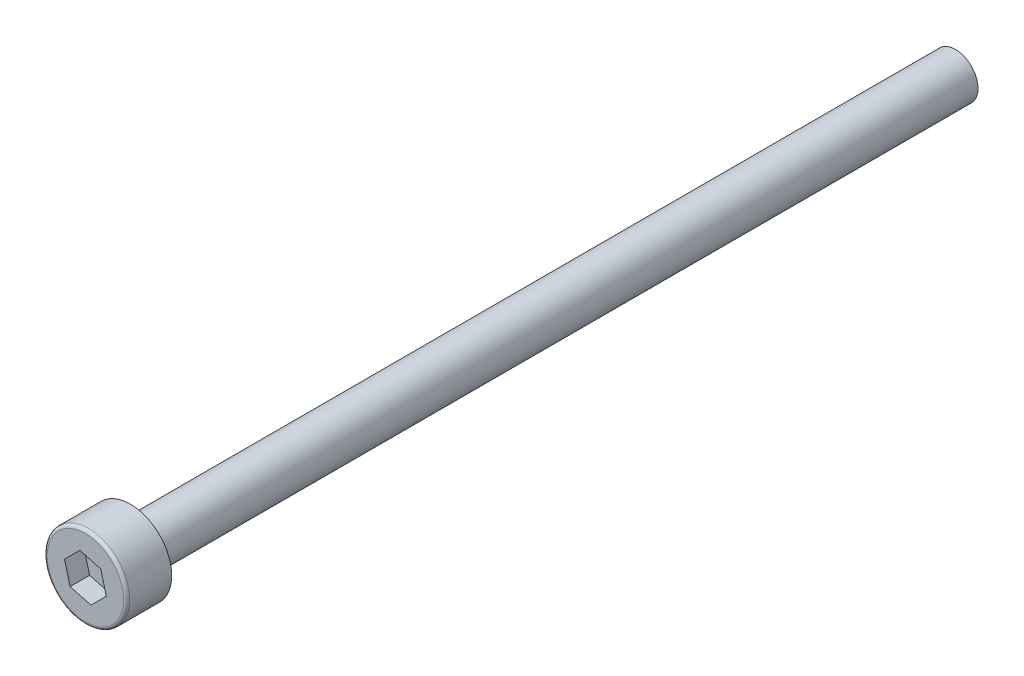
ISO-10303-21;
HEADER;
FILE_DESCRIPTION(('STEP AP214'),'2;1');
FILE_NAME('part.step','',(''),(''),'','','');
FILE_SCHEMA(('AUTOMOTIVE_DESIGN { 1 0 10303 214 1 1 1 1 }'));
ENDSEC;
DATA;
#1=APPLICATION_CONTEXT('core data for automotive mechanical design processes');
#2=APPLICATION_PROTOCOL_DEFINITION('international standard','automotive_design',2000,#1);
#3=PRODUCT_CONTEXT('',#1,'mechanical');
#4=PRODUCT('Part','Part','',(#3));
#5=PRODUCT_RELATED_PRODUCT_CATEGORY('part','',(#4));
#6=PRODUCT_DEFINITION_FORMATION('','',#4);
#7=PRODUCT_DEFINITION_CONTEXT('part definition',#1,'design');
#8=PRODUCT_DEFINITION('design','',#6,#7);
#9=PRODUCT_DEFINITION_SHAPE('','',#8);
#10=(LENGTH_UNIT() NAMED_UNIT(*) SI_UNIT(.MILLI.,.METRE.));
#11=(NAMED_UNIT(*) PLANE_ANGLE_UNIT() SI_UNIT($,.RADIAN.));
#12=(NAMED_UNIT(*) SI_UNIT($,.STERADIAN.) SOLID_ANGLE_UNIT());
#13=UNCERTAINTY_MEASURE_WITH_UNIT(LENGTH_MEASURE(1.E-05),#10,'distance_accuracy_value','');
#14=(GEOMETRIC_REPRESENTATION_CONTEXT(3) GLOBAL_UNCERTAINTY_ASSIGNED_CONTEXT((#13)) GLOBAL_UNIT_ASSIGNED_CONTEXT((#10,
#11,#12)) REPRESENTATION_CONTEXT('',''));
#15=CARTESIAN_POINT('',(0.,0.,0.));
#16=DIRECTION('',(0.,0.,1.));
#17=DIRECTION('',(1.,0.,0.));
#18=AXIS2_PLACEMENT_3D('',#15,#16,#17);
#19=CARTESIAN_POINT('',(0.,0.,0.));
#20=DIRECTION('',(0.,0.,1.));
#21=DIRECTION('',(1.,0.,0.));
#22=AXIS2_PLACEMENT_3D('',#19,#20,#21);
#23=PLANE('',#22);
#24=CARTESIAN_POINT('',(0.,0.,0.));
#25=DIRECTION('',(0.,0.,1.));
#26=DIRECTION('',(1.,0.,0.));
#27=AXIS2_PLACEMENT_3D('',#24,#25,#26);
#28=CIRCLE('',#27,2.75);
#29=CARTESIAN_POINT('',(2.75,0.,0.));
#30=VERTEX_POINT('',#29);
#31=EDGE_CURVE('E137',#30,#30,#28,.T.);
#32=ORIENTED_EDGE('',*,*,#31,.F.);
#33=EDGE_LOOP('',(#32));
#34=FACE_BOUND('',#33,.T.);
#35=CARTESIAN_POINT('',(0.,0.,0.));
#36=DIRECTION('',(0.,0.,1.));
#37=DIRECTION('',(1.,0.,0.));
#38=AXIS2_PLACEMENT_3D('',#35,#36,#37);
#39=CIRCLE('',#38,1.5);
#40=CARTESIAN_POINT('',(1.5,0.,0.));
#41=VERTEX_POINT('',#40);
#42=EDGE_CURVE('E145',#41,#41,#39,.F.);
#43=ORIENTED_EDGE('',*,*,#42,.F.);
#44=EDGE_LOOP('',(#43));
#45=FACE_BOUND('',#44,.T.);
#46=ADVANCED_FACE('F34',(#34,#45),#23,.F.);
#47=CARTESIAN_POINT('',(0.,0.,3.));
#48=DIRECTION('',(0.,0.,-1.));
#49=DIRECTION('',(-1.,0.,0.));
#50=AXIS2_PLACEMENT_3D('',#47,#48,#49);
#51=CYLINDRICAL_SURFACE('',#50,2.75);
#52=CARTESIAN_POINT('',(0.,0.,2.8));
#53=DIRECTION('',(0.,0.,1.));
#54=DIRECTION('',(1.,0.,0.));
#55=AXIS2_PLACEMENT_3D('',#52,#53,#54);
#56=CIRCLE('',#55,2.75);
#57=CARTESIAN_POINT('',(2.75,0.,2.8));
#58=VERTEX_POINT('',#57);
#59=EDGE_CURVE('E11',#58,#58,#56,.F.);
#60=ORIENTED_EDGE('',*,*,#59,.T.);
#61=EDGE_LOOP('',(#60));
#62=FACE_BOUND('',#61,.T.);
#63=ORIENTED_EDGE('',*,*,#31,.T.);
#64=EDGE_LOOP('',(#63));
#65=FACE_BOUND('',#64,.T.);
#66=ADVANCED_FACE('F164',(#62,#65),#51,.T.);
#67=CARTESIAN_POINT('',(0.,0.,3.));
#68=DIRECTION('',(0.,0.,1.));
#69=DIRECTION('',(1.,0.,0.));
#70=AXIS2_PLACEMENT_3D('',#67,#68,#69);
#71=PLANE('',#70);
#72=CARTESIAN_POINT('',(0.,0.,3.));
#73=DIRECTION('',(0.,0.,1.));
#74=DIRECTION('',(1.,0.,0.));
#75=AXIS2_PLACEMENT_3D('',#72,#73,#74);
#76=CIRCLE('',#75,2.55);
#77=CARTESIAN_POINT('',(2.55,0.,3.));
#78=VERTEX_POINT('',#77);
#79=EDGE_CURVE('E42',#78,#78,#76,.T.);
#80=ORIENTED_EDGE('',*,*,#79,.T.);
#81=EDGE_LOOP('',(#80));
#82=FACE_BOUND('',#81,.T.);
#83=DIRECTION('',(0.258819045102521,-0.965925826289068,0.));
#84=VECTOR('',#83,1.);
#85=CARTESIAN_POINT('',(-1.39419383956301,0.373573113403356,3.));
#86=LINE('',#85,#84);
#87=CARTESIAN_POINT('',(-1.39419383956301,0.373573113403356,3.));
#88=VERTEX_POINT('',#87);
#89=CARTESIAN_POINT('',(-1.02062072615966,-1.02062072615966,3.));
#90=VERTEX_POINT('',#89);
#91=EDGE_CURVE('E49',#88,#90,#86,.T.);
#92=ORIENTED_EDGE('',*,*,#91,.F.);
#93=DIRECTION('',(-0.707106781186548,-0.707106781186548,0.));
#94=VECTOR('',#93,1.);
#95=CARTESIAN_POINT('',(-0.373573113403355,1.39419383956301,3.));
#96=LINE('',#95,#94);
#97=CARTESIAN_POINT('',(-0.373573113403355,1.39419383956301,3.));
#98=VERTEX_POINT('',#97);
#99=EDGE_CURVE('E133',#98,#88,#96,.T.);
#100=ORIENTED_EDGE('',*,*,#99,.F.);
#101=DIRECTION('',(-0.965925826289068,0.258819045102521,0.));
#102=VECTOR('',#101,1.);
#103=CARTESIAN_POINT('',(1.02062072615966,1.02062072615966,3.));
#104=LINE('',#103,#102);
#105=CARTESIAN_POINT('',(1.02062072615966,1.02062072615966,3.));
#106=VERTEX_POINT('',#105);
#107=EDGE_CURVE('E131',#106,#98,#104,.T.);
#108=ORIENTED_EDGE('',*,*,#107,.F.);
#109=DIRECTION('',(-0.258819045102521,0.965925826289068,0.));
#110=VECTOR('',#109,1.);
#111=CARTESIAN_POINT('',(1.39419383956301,-0.373573113403355,3.));
#112=LINE('',#111,#110);
#113=CARTESIAN_POINT('',(1.39419383956301,-0.373573113403355,3.));
#114=VERTEX_POINT('',#113);
#115=EDGE_CURVE('E97',#114,#106,#112,.T.);
#116=ORIENTED_EDGE('',*,*,#115,.F.);
#117=DIRECTION('',(0.707106781186548,0.707106781186548,0.));
#118=VECTOR('',#117,1.);
#119=CARTESIAN_POINT('',(0.373573113403355,-1.39419383956301,3.));
#120=LINE('',#119,#118);
#121=CARTESIAN_POINT('',(0.373573113403355,-1.39419383956301,3.));
#122=VERTEX_POINT('',#121);
#123=EDGE_CURVE('E127',#122,#114,#120,.T.);
#124=ORIENTED_EDGE('',*,*,#123,.F.);
#125=DIRECTION('',(0.965925826289068,-0.258819045102521,0.));
#126=VECTOR('',#125,1.);
#127=CARTESIAN_POINT('',(-1.02062072615966,-1.02062072615966,3.));
#128=LINE('',#127,#126);
#129=EDGE_CURVE('E123',#90,#122,#128,.T.);
#130=ORIENTED_EDGE('',*,*,#129,.F.);
#131=EDGE_LOOP('',(#92,#100,#108,#116,#124,#130));
#132=FACE_BOUND('',#131,.T.);
#133=ADVANCED_FACE('F150',(#82,#132),#71,.T.);
#134=CARTESIAN_POINT('',(-1.39419383956301,0.373573113403356,1.7));
#135=DIRECTION('',(-0.965925826289068,-0.258819045102521,0.));
#136=DIRECTION('',(0.258819045102521,-0.965925826289068,0.));
#137=AXIS2_PLACEMENT_3D('',#134,#135,#136);
#138=PLANE('',#137);
#139=ORIENTED_EDGE('',*,*,#91,.T.);
#140=DIRECTION('',(0.,0.,1.));
#141=VECTOR('',#140,1.);
#142=CARTESIAN_POINT('',(-1.02062072615966,-1.02062072615966,1.7));
#143=LINE('',#142,#141);
#144=CARTESIAN_POINT('',(-1.02062072615966,-1.02062072615966,1.7));
#145=VERTEX_POINT('',#144);
#146=EDGE_CURVE('E79',#145,#90,#143,.T.);
#147=ORIENTED_EDGE('',*,*,#146,.F.);
#148=DIRECTION('',(0.258819045102521,-0.965925826289068,0.));
#149=VECTOR('',#148,1.);
#150=CARTESIAN_POINT('',(-1.39419383956301,0.373573113403356,1.7));
#151=LINE('',#150,#149);
#152=CARTESIAN_POINT('',(-1.39419383956301,0.373573113403356,1.7));
#153=VERTEX_POINT('',#152);
#154=EDGE_CURVE('E135',#153,#145,#151,.T.);
#155=ORIENTED_EDGE('',*,*,#154,.F.);
#156=DIRECTION('',(0.,0.,1.));
#157=VECTOR('',#156,1.);
#158=CARTESIAN_POINT('',(-1.39419383956301,0.373573113403356,1.7));
#159=LINE('',#158,#157);
#160=EDGE_CURVE('E57',#153,#88,#159,.T.);
#161=ORIENTED_EDGE('',*,*,#160,.T.);
#162=EDGE_LOOP('',(#139,#147,#155,#161));
#163=FACE_BOUND('',#162,.T.);
#164=ADVANCED_FACE('F176',(#163),#138,.F.);
#165=CARTESIAN_POINT('',(-0.373573113403355,1.39419383956301,1.7));
#166=DIRECTION('',(-0.707106781186548,0.707106781186548,0.));
#167=DIRECTION('',(-0.707106781186548,-0.707106781186548,0.));
#168=AXIS2_PLACEMENT_3D('',#165,#166,#167);
#169=PLANE('',#168);
#170=ORIENTED_EDGE('',*,*,#99,.T.);
#171=ORIENTED_EDGE('',*,*,#160,.F.);
#172=DIRECTION('',(-0.707106781186548,-0.707106781186548,0.));
#173=VECTOR('',#172,1.);
#174=CARTESIAN_POINT('',(-0.373573113403355,1.39419383956301,1.7));
#175=LINE('',#174,#173);
#176=CARTESIAN_POINT('',(-0.373573113403355,1.39419383956301,1.7));
#177=VERTEX_POINT('',#176);
#178=EDGE_CURVE('E109',#177,#153,#175,.T.);
#179=ORIENTED_EDGE('',*,*,#178,.F.);
#180=DIRECTION('',(0.,0.,1.));
#181=VECTOR('',#180,1.);
#182=CARTESIAN_POINT('',(-0.373573113403355,1.39419383956301,1.7));
#183=LINE('',#182,#181);
#184=EDGE_CURVE('E101',#177,#98,#183,.T.);
#185=ORIENTED_EDGE('',*,*,#184,.T.);
#186=EDGE_LOOP('',(#170,#171,#179,#185));
#187=FACE_BOUND('',#186,.T.);
#188=ADVANCED_FACE('F179',(#187),#169,.F.);
#189=CARTESIAN_POINT('',(1.02062072615966,1.02062072615966,1.7));
#190=DIRECTION('',(0.258819045102521,0.965925826289068,0.));
#191=DIRECTION('',(-0.965925826289068,0.258819045102521,0.));
#192=AXIS2_PLACEMENT_3D('',#189,#190,#191);
#193=PLANE('',#192);
#194=ORIENTED_EDGE('',*,*,#107,.T.);
#195=ORIENTED_EDGE('',*,*,#184,.F.);
#196=DIRECTION('',(-0.965925826289068,0.258819045102521,0.));
#197=VECTOR('',#196,1.);
#198=CARTESIAN_POINT('',(1.02062072615966,1.02062072615966,1.7));
#199=LINE('',#198,#197);
#200=CARTESIAN_POINT('',(1.02062072615966,1.02062072615966,1.7));
#201=VERTEX_POINT('',#200);
#202=EDGE_CURVE('E105',#201,#177,#199,.T.);
#203=ORIENTED_EDGE('',*,*,#202,.F.);
#204=DIRECTION('',(0.,0.,1.));
#205=VECTOR('',#204,1.);
#206=CARTESIAN_POINT('',(1.02062072615966,1.02062072615966,1.7));
#207=LINE('',#206,#205);
#208=EDGE_CURVE('E90',#201,#106,#207,.T.);
#209=ORIENTED_EDGE('',*,*,#208,.T.);
#210=EDGE_LOOP('',(#194,#195,#203,#209));
#211=FACE_BOUND('',#210,.T.);
#212=ADVANCED_FACE('F106',(#211),#193,.F.);
#213=CARTESIAN_POINT('',(1.39419383956301,-0.373573113403355,1.7));
#214=DIRECTION('',(0.965925826289068,0.258819045102521,0.));
#215=DIRECTION('',(-0.258819045102521,0.965925826289068,0.));
#216=AXIS2_PLACEMENT_3D('',#213,#214,#215);
#217=PLANE('',#216);
#218=ORIENTED_EDGE('',*,*,#115,.T.);
#219=ORIENTED_EDGE('',*,*,#208,.F.);
#220=DIRECTION('',(-0.258819045102521,0.965925826289068,0.));
#221=VECTOR('',#220,1.);
#222=CARTESIAN_POINT('',(1.39419383956301,-0.373573113403355,1.7));
#223=LINE('',#222,#221);
#224=CARTESIAN_POINT('',(1.39419383956301,-0.373573113403355,1.7));
#225=VERTEX_POINT('',#224);
#226=EDGE_CURVE('E94',#225,#201,#223,.T.);
#227=ORIENTED_EDGE('',*,*,#226,.F.);
#228=DIRECTION('',(0.,0.,1.));
#229=VECTOR('',#228,1.);
#230=CARTESIAN_POINT('',(1.39419383956301,-0.373573113403355,1.7));
#231=LINE('',#230,#229);
#232=EDGE_CURVE('E102',#225,#114,#231,.T.);
#233=ORIENTED_EDGE('',*,*,#232,.T.);
#234=EDGE_LOOP('',(#218,#219,#227,#233));
#235=FACE_BOUND('',#234,.T.);
#236=ADVANCED_FACE('F92',(#235),#217,.F.);
#237=CARTESIAN_POINT('',(0.373573113403355,-1.39419383956301,1.7));
#238=DIRECTION('',(0.707106781186548,-0.707106781186548,0.));
#239=DIRECTION('',(0.707106781186548,0.707106781186548,0.));
#240=AXIS2_PLACEMENT_3D('',#237,#238,#239);
#241=PLANE('',#240);
#242=ORIENTED_EDGE('',*,*,#123,.T.);
#243=ORIENTED_EDGE('',*,*,#232,.F.);
#244=DIRECTION('',(0.707106781186548,0.707106781186548,0.));
#245=VECTOR('',#244,1.);
#246=CARTESIAN_POINT('',(0.373573113403355,-1.39419383956301,1.7));
#247=LINE('',#246,#245);
#248=CARTESIAN_POINT('',(0.373573113403355,-1.39419383956301,1.7));
#249=VERTEX_POINT('',#248);
#250=EDGE_CURVE('E115',#249,#225,#247,.T.);
#251=ORIENTED_EDGE('',*,*,#250,.F.);
#252=DIRECTION('',(0.,0.,1.));
#253=VECTOR('',#252,1.);
#254=CARTESIAN_POINT('',(0.373573113403355,-1.39419383956301,1.7));
#255=LINE('',#254,#253);
#256=EDGE_CURVE('E140',#249,#122,#255,.T.);
#257=ORIENTED_EDGE('',*,*,#256,.T.);
#258=EDGE_LOOP('',(#242,#243,#251,#257));
#259=FACE_BOUND('',#258,.T.);
#260=ADVANCED_FACE('F183',(#259),#241,.F.);
#261=CARTESIAN_POINT('',(-1.02062072615966,-1.02062072615966,1.7));
#262=DIRECTION('',(-0.258819045102521,-0.965925826289068,0.));
#263=DIRECTION('',(0.965925826289068,-0.258819045102521,0.));
#264=AXIS2_PLACEMENT_3D('',#261,#262,#263);
#265=PLANE('',#264);
#266=ORIENTED_EDGE('',*,*,#129,.T.);
#267=ORIENTED_EDGE('',*,*,#256,.F.);
#268=DIRECTION('',(0.965925826289068,-0.258819045102521,0.));
#269=VECTOR('',#268,1.);
#270=CARTESIAN_POINT('',(-1.02062072615966,-1.02062072615966,1.7));
#271=LINE('',#270,#269);
#272=EDGE_CURVE('E117',#145,#249,#271,.T.);
#273=ORIENTED_EDGE('',*,*,#272,.F.);
#274=ORIENTED_EDGE('',*,*,#146,.T.);
#275=EDGE_LOOP('',(#266,#267,#273,#274));
#276=FACE_BOUND('',#275,.T.);
#277=ADVANCED_FACE('F180',(#276),#265,.F.);
#278=CARTESIAN_POINT('',(0.,0.,1.7));
#279=DIRECTION('',(0.,0.,1.));
#280=DIRECTION('',(1.,0.,0.));
#281=AXIS2_PLACEMENT_3D('',#278,#279,#280);
#282=PLANE('',#281);
#283=ORIENTED_EDGE('',*,*,#154,.T.);
#284=ORIENTED_EDGE('',*,*,#272,.T.);
#285=ORIENTED_EDGE('',*,*,#250,.T.);
#286=ORIENTED_EDGE('',*,*,#226,.T.);
#287=ORIENTED_EDGE('',*,*,#202,.T.);
#288=ORIENTED_EDGE('',*,*,#178,.T.);
#289=EDGE_LOOP('',(#283,#284,#285,#286,#287,#288));
#290=FACE_BOUND('',#289,.T.);
#291=ADVANCED_FACE('F112',(#290),#282,.T.);
#292=CARTESIAN_POINT('',(0.,0.,-55.));
#293=DIRECTION('',(0.,0.,1.));
#294=DIRECTION('',(1.,0.,0.));
#295=AXIS2_PLACEMENT_3D('',#292,#293,#294);
#296=CYLINDRICAL_SURFACE('',#295,1.5);
#297=CARTESIAN_POINT('',(0.,0.,-55.));
#298=DIRECTION('',(0.,0.,-1.));
#299=DIRECTION('',(-1.,0.,0.));
#300=AXIS2_PLACEMENT_3D('',#297,#298,#299);
#301=CIRCLE('',#300,1.5);
#302=CARTESIAN_POINT('',(-1.5,0.,-55.));
#303=VERTEX_POINT('',#302);
#304=EDGE_CURVE('E124',#303,#303,#301,.T.);
#305=ORIENTED_EDGE('',*,*,#304,.F.);
#306=EDGE_LOOP('',(#305));
#307=FACE_BOUND('',#306,.T.);
#308=ORIENTED_EDGE('',*,*,#42,.T.);
#309=EDGE_LOOP('',(#308));
#310=FACE_BOUND('',#309,.T.);
#311=ADVANCED_FACE('F159',(#307,#310),#296,.T.);
#312=CARTESIAN_POINT('',(0.,0.,-55.));
#313=DIRECTION('',(0.,0.,-1.));
#314=DIRECTION('',(-1.,0.,0.));
#315=AXIS2_PLACEMENT_3D('',#312,#313,#314);
#316=PLANE('',#315);
#317=ORIENTED_EDGE('',*,*,#304,.T.);
#318=EDGE_LOOP('',(#317));
#319=FACE_BOUND('',#318,.T.);
#320=ADVANCED_FACE('F154',(#319),#316,.T.);
#321=CARTESIAN_POINT('',(0.,0.,2.8));
#322=DIRECTION('',(0.,0.,1.));
#323=DIRECTION('',(1.,0.,0.));
#324=AXIS2_PLACEMENT_3D('',#321,#322,#323);
#325=TOROIDAL_SURFACE('',#324,2.55,0.2);
#326=ORIENTED_EDGE('',*,*,#59,.F.);
#327=EDGE_LOOP('',(#326));
#328=FACE_BOUND('',#327,.T.);
#329=ORIENTED_EDGE('',*,*,#79,.F.);
#330=EDGE_LOOP('',(#329));
#331=FACE_BOUND('',#330,.T.);
#332=ADVANCED_FACE('F36',(#328,#331),#325,.T.);
#333=CLOSED_SHELL('',(#46,#66,#133,#164,#188,#212,#236,#260,#277,#291,#311,#320,#332));
#334=MANIFOLD_SOLID_BREP('B2',#333);
#335=ADVANCED_BREP_SHAPE_REPRESENTATION('',(#18,#334),#14);
#336=SHAPE_DEFINITION_REPRESENTATION(#9,#335);
ENDSEC;
END-ISO-10303-21;
